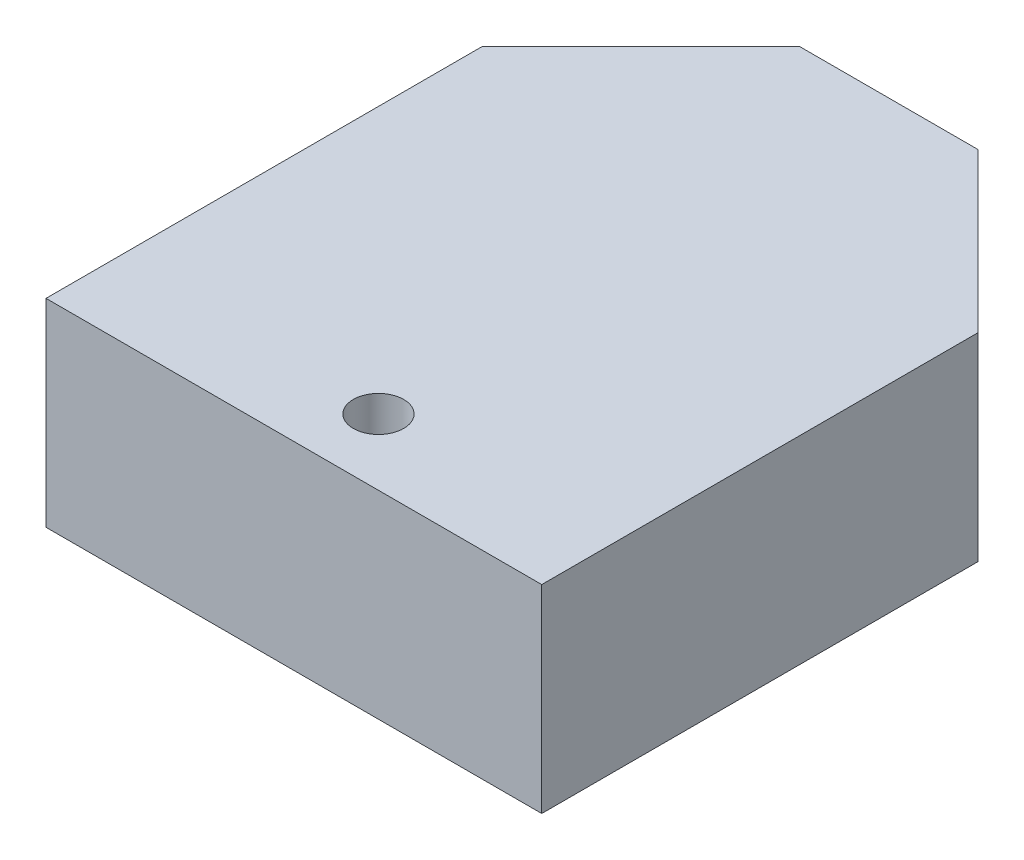
ISO-10303-21;
HEADER;
FILE_DESCRIPTION(('STEP AP214'),'2;1');
FILE_NAME('part.step','',(''),(''),'','','');
FILE_SCHEMA(('AUTOMOTIVE_DESIGN { 1 0 10303 214 1 1 1 1 }'));
ENDSEC;
DATA;
#1=APPLICATION_CONTEXT('core data for automotive mechanical design processes');
#2=APPLICATION_PROTOCOL_DEFINITION('international standard','automotive_design',2000,#1);
#3=PRODUCT_CONTEXT('',#1,'mechanical');
#4=PRODUCT('Part','Part','',(#3));
#5=PRODUCT_RELATED_PRODUCT_CATEGORY('part','',(#4));
#6=PRODUCT_DEFINITION_FORMATION('','',#4);
#7=PRODUCT_DEFINITION_CONTEXT('part definition',#1,'design');
#8=PRODUCT_DEFINITION('design','',#6,#7);
#9=PRODUCT_DEFINITION_SHAPE('','',#8);
#10=(LENGTH_UNIT() NAMED_UNIT(*) SI_UNIT(.MILLI.,.METRE.));
#11=(NAMED_UNIT(*) PLANE_ANGLE_UNIT() SI_UNIT($,.RADIAN.));
#12=(NAMED_UNIT(*) SI_UNIT($,.STERADIAN.) SOLID_ANGLE_UNIT());
#13=UNCERTAINTY_MEASURE_WITH_UNIT(LENGTH_MEASURE(1.E-05),#10,'distance_accuracy_value','');
#14=(GEOMETRIC_REPRESENTATION_CONTEXT(3) GLOBAL_UNCERTAINTY_ASSIGNED_CONTEXT((#13)) GLOBAL_UNIT_ASSIGNED_CONTEXT((#10,
#11,#12)) REPRESENTATION_CONTEXT('',''));
#15=CARTESIAN_POINT('',(0.,0.,0.));
#16=DIRECTION('',(0.,0.,1.));
#17=DIRECTION('',(1.,0.,0.));
#18=AXIS2_PLACEMENT_3D('',#15,#16,#17);
#19=CARTESIAN_POINT('',(4.5,10.,-15.));
#20=DIRECTION('',(-0.707106781186549,0.,0.707106781186546));
#21=DIRECTION('',(0.,1.,0.));
#22=AXIS2_PLACEMENT_3D('',#19,#20,#21);
#23=PLANE('',#22);
#24=DIRECTION('',(-0.707106781186546,0.,-0.707106781186549));
#25=VECTOR('',#24,1.);
#26=CARTESIAN_POINT('',(9.75,10.,-9.75));
#27=LINE('',#26,#25);
#28=CARTESIAN_POINT('',(12.5,10.,-7.));
#29=VERTEX_POINT('',#28);
#30=CARTESIAN_POINT('',(4.5,10.,-15.));
#31=VERTEX_POINT('',#30);
#32=EDGE_CURVE('E81',#29,#31,#27,.T.);
#33=ORIENTED_EDGE('',*,*,#32,.F.);
#34=DIRECTION('',(0.,1.,0.));
#35=VECTOR('',#34,1.);
#36=CARTESIAN_POINT('',(12.5,10.,-7.));
#37=LINE('',#36,#35);
#38=CARTESIAN_POINT('',(12.5,0.,-7.));
#39=VERTEX_POINT('',#38);
#40=EDGE_CURVE('E124',#39,#29,#37,.T.);
#41=ORIENTED_EDGE('',*,*,#40,.F.);
#42=DIRECTION('',(0.707106781186546,0.,0.707106781186549));
#43=VECTOR('',#42,1.);
#44=CARTESIAN_POINT('',(4.5,0.,-15.));
#45=LINE('',#44,#43);
#46=CARTESIAN_POINT('',(4.5,0.,-15.));
#47=VERTEX_POINT('',#46);
#48=EDGE_CURVE('E26',#47,#39,#45,.T.);
#49=ORIENTED_EDGE('',*,*,#48,.F.);
#50=DIRECTION('',(0.,-1.,0.));
#51=VECTOR('',#50,1.);
#52=CARTESIAN_POINT('',(4.5,10.,-15.));
#53=LINE('',#52,#51);
#54=EDGE_CURVE('E82',#31,#47,#53,.T.);
#55=ORIENTED_EDGE('',*,*,#54,.F.);
#56=EDGE_LOOP('',(#33,#41,#49,#55));
#57=FACE_BOUND('',#56,.T.);
#58=ADVANCED_FACE('F17',(#57),#23,.F.);
#59=CARTESIAN_POINT('',(-12.5,10.,-7.));
#60=DIRECTION('',(0.707106781186547,0.,0.707106781186549));
#61=DIRECTION('',(0.,-1.,0.));
#62=AXIS2_PLACEMENT_3D('',#59,#60,#61);
#63=PLANE('',#62);
#64=DIRECTION('',(-0.707106781186548,0.,0.707106781186547));
#65=VECTOR('',#64,1.);
#66=CARTESIAN_POINT('',(-9.75,10.,-9.75));
#67=LINE('',#66,#65);
#68=CARTESIAN_POINT('',(-4.5,10.,-15.));
#69=VERTEX_POINT('',#68);
#70=CARTESIAN_POINT('',(-12.5,10.,-7.));
#71=VERTEX_POINT('',#70);
#72=EDGE_CURVE('E67',#69,#71,#67,.T.);
#73=ORIENTED_EDGE('',*,*,#72,.F.);
#74=DIRECTION('',(0.,1.,0.));
#75=VECTOR('',#74,1.);
#76=CARTESIAN_POINT('',(-4.5,10.,-15.));
#77=LINE('',#76,#75);
#78=CARTESIAN_POINT('',(-4.5,0.,-15.));
#79=VERTEX_POINT('',#78);
#80=EDGE_CURVE('E72',#79,#69,#77,.T.);
#81=ORIENTED_EDGE('',*,*,#80,.F.);
#82=DIRECTION('',(0.707106781186548,0.,-0.707106781186547));
#83=VECTOR('',#82,1.);
#84=CARTESIAN_POINT('',(-12.5,0.,-7.));
#85=LINE('',#84,#83);
#86=CARTESIAN_POINT('',(-12.5,0.,-7.));
#87=VERTEX_POINT('',#86);
#88=EDGE_CURVE('E132',#87,#79,#85,.T.);
#89=ORIENTED_EDGE('',*,*,#88,.F.);
#90=DIRECTION('',(0.,-1.,0.));
#91=VECTOR('',#90,1.);
#92=CARTESIAN_POINT('',(-12.5,10.,-7.));
#93=LINE('',#92,#91);
#94=EDGE_CURVE('E76',#71,#87,#93,.T.);
#95=ORIENTED_EDGE('',*,*,#94,.F.);
#96=EDGE_LOOP('',(#73,#81,#89,#95));
#97=FACE_BOUND('',#96,.T.);
#98=ADVANCED_FACE('F69',(#97),#63,.F.);
#99=CARTESIAN_POINT('',(0.932441038357691,5.,11.6658734354528));
#100=DIRECTION('',(0.,1.,0.));
#101=DIRECTION('',(1.,0.,0.));
#102=AXIS2_PLACEMENT_3D('',#99,#100,#101);
#103=PLANE('',#102);
#104=CARTESIAN_POINT('',(0.932441038357691,5.,11.6658734354528));
#105=DIRECTION('',(0.,1.,0.));
#106=DIRECTION('',(0.,0.,1.));
#107=AXIS2_PLACEMENT_3D('',#104,#105,#106);
#108=CIRCLE('',#107,1.2700752794994);
#109=CARTESIAN_POINT('',(0.932441038357691,5.,12.9359487149522));
#110=VERTEX_POINT('',#109);
#111=EDGE_CURVE('E11',#110,#110,#108,.T.);
#112=ORIENTED_EDGE('',*,*,#111,.T.);
#113=EDGE_LOOP('',(#112));
#114=FACE_BOUND('',#113,.T.);
#115=ADVANCED_FACE('F286',(#114),#103,.T.);
#116=CARTESIAN_POINT('',(0.932441038357691,5.,11.6658734354528));
#117=DIRECTION('',(0.,1.,0.));
#118=DIRECTION('',(0.,0.,1.));
#119=AXIS2_PLACEMENT_3D('',#116,#117,#118);
#120=CYLINDRICAL_SURFACE('',#119,1.2700752794994);
#121=ORIENTED_EDGE('',*,*,#111,.F.);
#122=EDGE_LOOP('',(#121));
#123=FACE_BOUND('',#122,.T.);
#124=CARTESIAN_POINT('',(0.932441038357691,10.,11.6658734354528));
#125=DIRECTION('',(0.,1.,0.));
#126=DIRECTION('',(0.,0.,1.));
#127=AXIS2_PLACEMENT_3D('',#124,#125,#126);
#128=CIRCLE('',#127,1.2700752794994);
#129=CARTESIAN_POINT('',(0.932441038357691,10.,12.9359487149522));
#130=VERTEX_POINT('',#129);
#131=EDGE_CURVE('E129',#130,#130,#128,.T.);
#132=ORIENTED_EDGE('',*,*,#131,.T.);
#133=EDGE_LOOP('',(#132));
#134=FACE_BOUND('',#133,.T.);
#135=ADVANCED_FACE('F292',(#123,#134),#120,.F.);
#136=CARTESIAN_POINT('',(0.,0.,0.));
#137=DIRECTION('',(0.,1.,0.));
#138=DIRECTION('',(1.,0.,0.));
#139=AXIS2_PLACEMENT_3D('',#136,#137,#138);
#140=PLANE('',#139);
#141=DIRECTION('',(0.,0.,1.));
#142=VECTOR('',#141,1.);
#143=CARTESIAN_POINT('',(-12.5,0.,15.));
#144=LINE('',#143,#142);
#145=CARTESIAN_POINT('',(-12.5,0.,15.));
#146=VERTEX_POINT('',#145);
#147=EDGE_CURVE('E161',#87,#146,#144,.T.);
#148=ORIENTED_EDGE('',*,*,#147,.F.);
#149=ORIENTED_EDGE('',*,*,#88,.T.);
#150=DIRECTION('',(-1.,0.,0.));
#151=VECTOR('',#150,1.);
#152=CARTESIAN_POINT('',(12.5,0.,-15.));
#153=LINE('',#152,#151);
#154=EDGE_CURVE('E96',#47,#79,#153,.T.);
#155=ORIENTED_EDGE('',*,*,#154,.F.);
#156=ORIENTED_EDGE('',*,*,#48,.T.);
#157=DIRECTION('',(0.,0.,-1.));
#158=VECTOR('',#157,1.);
#159=CARTESIAN_POINT('',(12.5,0.,15.));
#160=LINE('',#159,#158);
#161=CARTESIAN_POINT('',(12.5,0.,15.));
#162=VERTEX_POINT('',#161);
#163=EDGE_CURVE('E115',#162,#39,#160,.T.);
#164=ORIENTED_EDGE('',*,*,#163,.F.);
#165=DIRECTION('',(1.,0.,0.));
#166=VECTOR('',#165,1.);
#167=CARTESIAN_POINT('',(12.5,0.,15.));
#168=LINE('',#167,#166);
#169=EDGE_CURVE('E117',#146,#162,#168,.T.);
#170=ORIENTED_EDGE('',*,*,#169,.F.);
#171=EDGE_LOOP('',(#148,#149,#155,#156,#164,#170));
#172=FACE_BOUND('',#171,.T.);
#173=ADVANCED_FACE('F142',(#172),#140,.F.);
#174=CARTESIAN_POINT('',(0.,10.,0.));
#175=DIRECTION('',(0.,1.,0.));
#176=DIRECTION('',(1.,0.,0.));
#177=AXIS2_PLACEMENT_3D('',#174,#175,#176);
#178=PLANE('',#177);
#179=ORIENTED_EDGE('',*,*,#131,.F.);
#180=EDGE_LOOP('',(#179));
#181=FACE_BOUND('',#180,.T.);
#182=DIRECTION('',(-1.,0.,0.));
#183=VECTOR('',#182,1.);
#184=CARTESIAN_POINT('',(12.5,10.,-15.));
#185=LINE('',#184,#183);
#186=EDGE_CURVE('E85',#31,#69,#185,.T.);
#187=ORIENTED_EDGE('',*,*,#186,.T.);
#188=ORIENTED_EDGE('',*,*,#72,.T.);
#189=DIRECTION('',(0.,0.,1.));
#190=VECTOR('',#189,1.);
#191=CARTESIAN_POINT('',(-12.5,10.,15.));
#192=LINE('',#191,#190);
#193=CARTESIAN_POINT('',(-12.5,10.,15.));
#194=VERTEX_POINT('',#193);
#195=EDGE_CURVE('E449',#71,#194,#192,.T.);
#196=ORIENTED_EDGE('',*,*,#195,.T.);
#197=DIRECTION('',(1.,0.,0.));
#198=VECTOR('',#197,1.);
#199=CARTESIAN_POINT('',(12.5,10.,15.));
#200=LINE('',#199,#198);
#201=CARTESIAN_POINT('',(12.5,10.,15.));
#202=VERTEX_POINT('',#201);
#203=EDGE_CURVE('E111',#194,#202,#200,.T.);
#204=ORIENTED_EDGE('',*,*,#203,.T.);
#205=DIRECTION('',(0.,0.,-1.));
#206=VECTOR('',#205,1.);
#207=CARTESIAN_POINT('',(12.5,10.,15.));
#208=LINE('',#207,#206);
#209=EDGE_CURVE('E103',#202,#29,#208,.T.);
#210=ORIENTED_EDGE('',*,*,#209,.T.);
#211=ORIENTED_EDGE('',*,*,#32,.T.);
#212=EDGE_LOOP('',(#187,#188,#196,#204,#210,#211));
#213=FACE_BOUND('',#212,.T.);
#214=ADVANCED_FACE('F86',(#181,#213),#178,.T.);
#215=CARTESIAN_POINT('',(12.5,10.,-15.));
#216=DIRECTION('',(0.,0.,1.));
#217=DIRECTION('',(1.,0.,0.));
#218=AXIS2_PLACEMENT_3D('',#215,#216,#217);
#219=PLANE('',#218);
#220=ORIENTED_EDGE('',*,*,#154,.T.);
#221=ORIENTED_EDGE('',*,*,#80,.T.);
#222=ORIENTED_EDGE('',*,*,#186,.F.);
#223=ORIENTED_EDGE('',*,*,#54,.T.);
#224=EDGE_LOOP('',(#220,#221,#222,#223));
#225=FACE_BOUND('',#224,.T.);
#226=ADVANCED_FACE('F94',(#225),#219,.F.);
#227=CARTESIAN_POINT('',(12.5,10.,15.));
#228=DIRECTION('',(-1.,0.,0.));
#229=DIRECTION('',(0.,0.,1.));
#230=AXIS2_PLACEMENT_3D('',#227,#228,#229);
#231=PLANE('',#230);
#232=ORIENTED_EDGE('',*,*,#163,.T.);
#233=ORIENTED_EDGE('',*,*,#40,.T.);
#234=ORIENTED_EDGE('',*,*,#209,.F.);
#235=DIRECTION('',(0.,-1.,0.));
#236=VECTOR('',#235,1.);
#237=CARTESIAN_POINT('',(12.5,10.,15.));
#238=LINE('',#237,#236);
#239=EDGE_CURVE('E116',#202,#162,#238,.T.);
#240=ORIENTED_EDGE('',*,*,#239,.T.);
#241=EDGE_LOOP('',(#232,#233,#234,#240));
#242=FACE_BOUND('',#241,.T.);
#243=ADVANCED_FACE('F149',(#242),#231,.F.);
#244=CARTESIAN_POINT('',(12.5,10.,15.));
#245=DIRECTION('',(0.,0.,-1.));
#246=DIRECTION('',(-1.,0.,0.));
#247=AXIS2_PLACEMENT_3D('',#244,#245,#246);
#248=PLANE('',#247);
#249=ORIENTED_EDGE('',*,*,#169,.T.);
#250=ORIENTED_EDGE('',*,*,#239,.F.);
#251=ORIENTED_EDGE('',*,*,#203,.F.);
#252=DIRECTION('',(0.,-1.,0.));
#253=VECTOR('',#252,1.);
#254=CARTESIAN_POINT('',(-12.5,10.,15.));
#255=LINE('',#254,#253);
#256=EDGE_CURVE('E107',#194,#146,#255,.T.);
#257=ORIENTED_EDGE('',*,*,#256,.T.);
#258=EDGE_LOOP('',(#249,#250,#251,#257));
#259=FACE_BOUND('',#258,.T.);
#260=ADVANCED_FACE('F157',(#259),#248,.F.);
#261=CARTESIAN_POINT('',(-12.5,10.,15.));
#262=DIRECTION('',(1.,0.,0.));
#263=DIRECTION('',(0.,1.,0.));
#264=AXIS2_PLACEMENT_3D('',#261,#262,#263);
#265=PLANE('',#264);
#266=ORIENTED_EDGE('',*,*,#195,.F.);
#267=ORIENTED_EDGE('',*,*,#94,.T.);
#268=ORIENTED_EDGE('',*,*,#147,.T.);
#269=ORIENTED_EDGE('',*,*,#256,.F.);
#270=EDGE_LOOP('',(#266,#267,#268,#269));
#271=FACE_BOUND('',#270,.T.);
#272=ADVANCED_FACE('F349',(#271),#265,.F.);
#273=CLOSED_SHELL('',(#58,#98,#115,#135,#173,#214,#226,#243,#260,#272));
#274=MANIFOLD_SOLID_BREP('B1',#273);
#275=ADVANCED_BREP_SHAPE_REPRESENTATION('',(#18,#274),#14);
#276=SHAPE_DEFINITION_REPRESENTATION(#9,#275);
ENDSEC;
END-ISO-10303-21;
